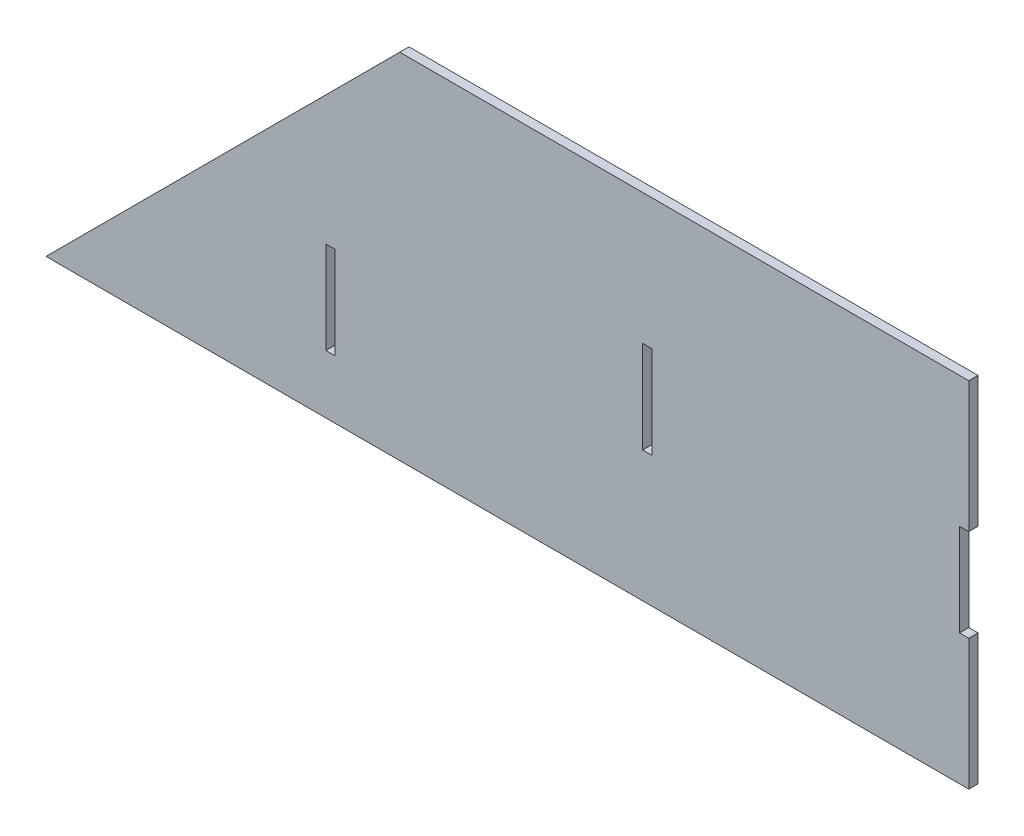
ISO-10303-21;
HEADER;
FILE_DESCRIPTION(('STEP AP214'),'2;1');
FILE_NAME('part.step','',(''),(''),'','','');
FILE_SCHEMA(('AUTOMOTIVE_DESIGN { 1 0 10303 214 1 1 1 1 }'));
ENDSEC;
DATA;
#1=APPLICATION_CONTEXT('core data for automotive mechanical design processes');
#2=APPLICATION_PROTOCOL_DEFINITION('international standard','automotive_design',2000,#1);
#3=PRODUCT_CONTEXT('',#1,'mechanical');
#4=PRODUCT('Part','Part','',(#3));
#5=PRODUCT_RELATED_PRODUCT_CATEGORY('part','',(#4));
#6=PRODUCT_DEFINITION_FORMATION('','',#4);
#7=PRODUCT_DEFINITION_CONTEXT('part definition',#1,'design');
#8=PRODUCT_DEFINITION('design','',#6,#7);
#9=PRODUCT_DEFINITION_SHAPE('','',#8);
#10=(LENGTH_UNIT() NAMED_UNIT(*) SI_UNIT(.MILLI.,.METRE.));
#11=(NAMED_UNIT(*) PLANE_ANGLE_UNIT() SI_UNIT($,.RADIAN.));
#12=(NAMED_UNIT(*) SI_UNIT($,.STERADIAN.) SOLID_ANGLE_UNIT());
#13=UNCERTAINTY_MEASURE_WITH_UNIT(LENGTH_MEASURE(1.E-05),#10,'distance_accuracy_value','');
#14=(GEOMETRIC_REPRESENTATION_CONTEXT(3) GLOBAL_UNCERTAINTY_ASSIGNED_CONTEXT((#13)) GLOBAL_UNIT_ASSIGNED_CONTEXT((#10,
#11,#12)) REPRESENTATION_CONTEXT('',''));
#15=CARTESIAN_POINT('',(0.,0.,0.));
#16=DIRECTION('',(0.,0.,1.));
#17=DIRECTION('',(1.,0.,0.));
#18=AXIS2_PLACEMENT_3D('',#15,#16,#17);
#19=CARTESIAN_POINT('',(0.,18.9920835924817,3.));
#20=DIRECTION('',(0.,-1.,0.));
#21=DIRECTION('',(0.,0.,-1.));
#22=AXIS2_PLACEMENT_3D('',#19,#20,#21);
#23=PLANE('',#22);
#24=DIRECTION('',(-1.,0.,0.));
#25=VECTOR('',#24,1.);
#26=CARTESIAN_POINT('',(0.,18.9920835924817,0.));
#27=LINE('',#26,#25);
#28=CARTESIAN_POINT('',(94.,18.9920835924817,0.));
#29=VERTEX_POINT('',#28);
#30=CARTESIAN_POINT('',(91.,18.9920835924817,0.));
#31=VERTEX_POINT('',#30);
#32=EDGE_CURVE('E219',#29,#31,#27,.T.);
#33=ORIENTED_EDGE('',*,*,#32,.T.);
#34=DIRECTION('',(0.,0.,-1.));
#35=VECTOR('',#34,1.);
#36=CARTESIAN_POINT('',(91.,18.9920835924817,3.));
#37=LINE('',#36,#35);
#38=CARTESIAN_POINT('',(91.,18.9920835924817,3.));
#39=VERTEX_POINT('',#38);
#40=EDGE_CURVE('E11',#39,#31,#37,.T.);
#41=ORIENTED_EDGE('',*,*,#40,.F.);
#42=DIRECTION('',(-1.,0.,0.));
#43=VECTOR('',#42,1.);
#44=CARTESIAN_POINT('',(0.,18.9920835924817,3.));
#45=LINE('',#44,#43);
#46=CARTESIAN_POINT('',(94.,18.9920835924817,3.));
#47=VERTEX_POINT('',#46);
#48=EDGE_CURVE('E166',#47,#39,#45,.T.);
#49=ORIENTED_EDGE('',*,*,#48,.F.);
#50=DIRECTION('',(0.,0.,-1.));
#51=VECTOR('',#50,1.);
#52=CARTESIAN_POINT('',(94.,18.9920835924817,3.));
#53=LINE('',#52,#51);
#54=EDGE_CURVE('E58',#47,#29,#53,.T.);
#55=ORIENTED_EDGE('',*,*,#54,.T.);
#56=EDGE_LOOP('',(#33,#41,#49,#55));
#57=FACE_BOUND('',#56,.T.);
#58=ADVANCED_FACE('F39',(#57),#23,.F.);
#59=CARTESIAN_POINT('',(91.,0.,3.));
#60=DIRECTION('',(-1.,0.,0.));
#61=DIRECTION('',(0.,0.,1.));
#62=AXIS2_PLACEMENT_3D('',#59,#60,#61);
#63=PLANE('',#62);
#64=DIRECTION('',(0.,1.,0.));
#65=VECTOR('',#64,1.);
#66=CARTESIAN_POINT('',(91.,0.,0.));
#67=LINE('',#66,#65);
#68=CARTESIAN_POINT('',(91.,48.9920835924817,0.));
#69=VERTEX_POINT('',#68);
#70=EDGE_CURVE('E172',#31,#69,#67,.T.);
#71=ORIENTED_EDGE('',*,*,#70,.T.);
#72=DIRECTION('',(0.,0.,-1.));
#73=VECTOR('',#72,1.);
#74=CARTESIAN_POINT('',(91.,48.9920835924817,3.));
#75=LINE('',#74,#73);
#76=CARTESIAN_POINT('',(91.,48.9920835924817,3.));
#77=VERTEX_POINT('',#76);
#78=EDGE_CURVE('E49',#77,#69,#75,.T.);
#79=ORIENTED_EDGE('',*,*,#78,.F.);
#80=DIRECTION('',(0.,1.,0.));
#81=VECTOR('',#80,1.);
#82=CARTESIAN_POINT('',(91.,0.,3.));
#83=LINE('',#82,#81);
#84=EDGE_CURVE('E160',#39,#77,#83,.T.);
#85=ORIENTED_EDGE('',*,*,#84,.F.);
#86=ORIENTED_EDGE('',*,*,#40,.T.);
#87=EDGE_LOOP('',(#71,#79,#85,#86));
#88=FACE_BOUND('',#87,.T.);
#89=ADVANCED_FACE('F171',(#88),#63,.F.);
#90=CARTESIAN_POINT('',(1.13316956726529E-13,48.9920835924819,3.));
#91=DIRECTION('',(0.,-1.,0.));
#92=DIRECTION('',(1.,0.,0.));
#93=AXIS2_PLACEMENT_3D('',#90,#91,#92);
#94=PLANE('',#93);
#95=DIRECTION('',(-1.,0.,0.));
#96=VECTOR('',#95,1.);
#97=CARTESIAN_POINT('',(1.13316956726529E-13,48.9920835924819,0.));
#98=LINE('',#97,#96);
#99=CARTESIAN_POINT('',(94.,48.9920835924817,0.));
#100=VERTEX_POINT('',#99);
#101=EDGE_CURVE('E222',#100,#69,#98,.T.);
#102=ORIENTED_EDGE('',*,*,#101,.F.);
#103=DIRECTION('',(0.,0.,-1.));
#104=VECTOR('',#103,1.);
#105=CARTESIAN_POINT('',(94.,48.9920835924817,3.));
#106=LINE('',#105,#104);
#107=CARTESIAN_POINT('',(94.,48.9920835924817,3.));
#108=VERTEX_POINT('',#107);
#109=EDGE_CURVE('E108',#108,#100,#106,.T.);
#110=ORIENTED_EDGE('',*,*,#109,.F.);
#111=DIRECTION('',(-1.,0.,0.));
#112=VECTOR('',#111,1.);
#113=CARTESIAN_POINT('',(1.13316956726529E-13,48.9920835924819,3.));
#114=LINE('',#113,#112);
#115=EDGE_CURVE('E165',#108,#77,#114,.T.);
#116=ORIENTED_EDGE('',*,*,#115,.T.);
#117=ORIENTED_EDGE('',*,*,#78,.T.);
#118=EDGE_LOOP('',(#102,#110,#116,#117));
#119=FACE_BOUND('',#118,.T.);
#120=ADVANCED_FACE('F176',(#119),#94,.T.);
#121=CARTESIAN_POINT('',(0.,42.5,3.));
#122=DIRECTION('',(0.,-1.,0.));
#123=DIRECTION('',(0.,0.,-1.));
#124=AXIS2_PLACEMENT_3D('',#121,#122,#123);
#125=PLANE('',#124);
#126=DIRECTION('',(-1.,0.,0.));
#127=VECTOR('',#126,1.);
#128=CARTESIAN_POINT('',(0.,42.5,0.));
#129=LINE('',#128,#127);
#130=CARTESIAN_POINT('',(197.,42.5,0.));
#131=VERTEX_POINT('',#130);
#132=CARTESIAN_POINT('',(194.,42.5,0.));
#133=VERTEX_POINT('',#132);
#134=EDGE_CURVE('E207',#131,#133,#129,.T.);
#135=ORIENTED_EDGE('',*,*,#134,.T.);
#136=DIRECTION('',(0.,0.,-1.));
#137=VECTOR('',#136,1.);
#138=CARTESIAN_POINT('',(194.,42.5,3.));
#139=LINE('',#138,#137);
#140=CARTESIAN_POINT('',(194.,42.5,3.));
#141=VERTEX_POINT('',#140);
#142=EDGE_CURVE('E229',#141,#133,#139,.T.);
#143=ORIENTED_EDGE('',*,*,#142,.F.);
#144=DIRECTION('',(-1.,0.,0.));
#145=VECTOR('',#144,1.);
#146=CARTESIAN_POINT('',(0.,42.5,3.));
#147=LINE('',#146,#145);
#148=CARTESIAN_POINT('',(197.,42.5,3.));
#149=VERTEX_POINT('',#148);
#150=EDGE_CURVE('E291',#149,#141,#147,.T.);
#151=ORIENTED_EDGE('',*,*,#150,.F.);
#152=DIRECTION('',(0.,0.,-1.));
#153=VECTOR('',#152,1.);
#154=CARTESIAN_POINT('',(197.,42.5,3.));
#155=LINE('',#154,#153);
#156=EDGE_CURVE('E231',#149,#131,#155,.T.);
#157=ORIENTED_EDGE('',*,*,#156,.T.);
#158=EDGE_LOOP('',(#135,#143,#151,#157));
#159=FACE_BOUND('',#158,.T.);
#160=ADVANCED_FACE('F315',(#159),#125,.F.);
#161=CARTESIAN_POINT('',(194.,0.,3.));
#162=DIRECTION('',(-1.,0.,0.));
#163=DIRECTION('',(0.,0.,1.));
#164=AXIS2_PLACEMENT_3D('',#161,#162,#163);
#165=PLANE('',#164);
#166=DIRECTION('',(0.,1.,0.));
#167=VECTOR('',#166,1.);
#168=CARTESIAN_POINT('',(194.,0.,0.));
#169=LINE('',#168,#167);
#170=CARTESIAN_POINT('',(194.,72.5000000000001,0.));
#171=VERTEX_POINT('',#170);
#172=EDGE_CURVE('E210',#133,#171,#169,.T.);
#173=ORIENTED_EDGE('',*,*,#172,.T.);
#174=DIRECTION('',(0.,0.,-1.));
#175=VECTOR('',#174,1.);
#176=CARTESIAN_POINT('',(194.,72.5000000000001,3.));
#177=LINE('',#176,#175);
#178=CARTESIAN_POINT('',(194.,72.5000000000001,3.));
#179=VERTEX_POINT('',#178);
#180=EDGE_CURVE('E235',#179,#171,#177,.T.);
#181=ORIENTED_EDGE('',*,*,#180,.F.);
#182=DIRECTION('',(0.,1.,0.));
#183=VECTOR('',#182,1.);
#184=CARTESIAN_POINT('',(194.,0.,3.));
#185=LINE('',#184,#183);
#186=EDGE_CURVE('E294',#141,#179,#185,.T.);
#187=ORIENTED_EDGE('',*,*,#186,.F.);
#188=ORIENTED_EDGE('',*,*,#142,.T.);
#189=EDGE_LOOP('',(#173,#181,#187,#188));
#190=FACE_BOUND('',#189,.T.);
#191=ADVANCED_FACE('F317',(#190),#165,.F.);
#192=CARTESIAN_POINT('',(0.,72.5000000000001,3.));
#193=DIRECTION('',(0.,-1.,0.));
#194=DIRECTION('',(0.,0.,-1.));
#195=AXIS2_PLACEMENT_3D('',#192,#193,#194);
#196=PLANE('',#195);
#197=DIRECTION('',(-1.,0.,0.));
#198=VECTOR('',#197,1.);
#199=CARTESIAN_POINT('',(0.,72.5000000000001,0.));
#200=LINE('',#199,#198);
#201=CARTESIAN_POINT('',(197.,72.5000000000001,0.));
#202=VERTEX_POINT('',#201);
#203=EDGE_CURVE('E213',#202,#171,#200,.T.);
#204=ORIENTED_EDGE('',*,*,#203,.F.);
#205=DIRECTION('',(0.,0.,-1.));
#206=VECTOR('',#205,1.);
#207=CARTESIAN_POINT('',(197.,72.5000000000001,3.));
#208=LINE('',#207,#206);
#209=CARTESIAN_POINT('',(197.,72.5000000000001,3.));
#210=VERTEX_POINT('',#209);
#211=EDGE_CURVE('E233',#210,#202,#208,.T.);
#212=ORIENTED_EDGE('',*,*,#211,.F.);
#213=DIRECTION('',(-1.,0.,0.));
#214=VECTOR('',#213,1.);
#215=CARTESIAN_POINT('',(0.,72.5000000000001,3.));
#216=LINE('',#215,#214);
#217=EDGE_CURVE('E296',#210,#179,#216,.T.);
#218=ORIENTED_EDGE('',*,*,#217,.T.);
#219=ORIENTED_EDGE('',*,*,#180,.T.);
#220=EDGE_LOOP('',(#204,#212,#218,#219));
#221=FACE_BOUND('',#220,.T.);
#222=ADVANCED_FACE('F311',(#221),#196,.T.);
#223=CARTESIAN_POINT('',(300.,0.,3.));
#224=DIRECTION('',(1.,0.,0.));
#225=DIRECTION('',(0.,0.,-1.));
#226=AXIS2_PLACEMENT_3D('',#223,#224,#225);
#227=PLANE('',#226);
#228=DIRECTION('',(0.,-1.,0.));
#229=VECTOR('',#228,1.);
#230=CARTESIAN_POINT('',(300.,0.,0.));
#231=LINE('',#230,#229);
#232=CARTESIAN_POINT('',(300.,42.4999999999995,0.));
#233=VERTEX_POINT('',#232);
#234=CARTESIAN_POINT('',(300.,0.,0.));
#235=VERTEX_POINT('',#234);
#236=EDGE_CURVE('E183',#233,#235,#231,.T.);
#237=ORIENTED_EDGE('',*,*,#236,.F.);
#238=DIRECTION('',(0.,0.,-1.));
#239=VECTOR('',#238,1.);
#240=CARTESIAN_POINT('',(300.,42.4999999999995,3.));
#241=LINE('',#240,#239);
#242=CARTESIAN_POINT('',(300.,42.4999999999995,3.));
#243=VERTEX_POINT('',#242);
#244=EDGE_CURVE('E43',#243,#233,#241,.T.);
#245=ORIENTED_EDGE('',*,*,#244,.F.);
#246=DIRECTION('',(0.,-1.,0.));
#247=VECTOR('',#246,1.);
#248=CARTESIAN_POINT('',(300.,0.,3.));
#249=LINE('',#248,#247);
#250=CARTESIAN_POINT('',(300.,0.,3.));
#251=VERTEX_POINT('',#250);
#252=EDGE_CURVE('E227',#243,#251,#249,.T.);
#253=ORIENTED_EDGE('',*,*,#252,.T.);
#254=DIRECTION('',(0.,0.,-1.));
#255=VECTOR('',#254,1.);
#256=CARTESIAN_POINT('',(300.,0.,3.));
#257=LINE('',#256,#255);
#258=EDGE_CURVE('E179',#251,#235,#257,.T.);
#259=ORIENTED_EDGE('',*,*,#258,.T.);
#260=EDGE_LOOP('',(#237,#245,#253,#259));
#261=FACE_BOUND('',#260,.T.);
#262=ADVANCED_FACE('F41',(#261),#227,.T.);
#263=CARTESIAN_POINT('',(6.48786580016017E-12,42.5000000000453,3.));
#264=DIRECTION('',(1.52655665885959E-13,1.,0.));
#265=DIRECTION('',(-1.,1.52655665885959E-13,0.));
#266=AXIS2_PLACEMENT_3D('',#263,#264,#265);
#267=PLANE('',#266);
#268=DIRECTION('',(1.,-1.52655665885959E-13,0.));
#269=VECTOR('',#268,1.);
#270=CARTESIAN_POINT('',(6.48786580016017E-12,42.5000000000453,0.));
#271=LINE('',#270,#269);
#272=CARTESIAN_POINT('',(297.,42.5,0.));
#273=VERTEX_POINT('',#272);
#274=EDGE_CURVE('E186',#273,#233,#271,.T.);
#275=ORIENTED_EDGE('',*,*,#274,.F.);
#276=DIRECTION('',(0.,0.,-1.));
#277=VECTOR('',#276,1.);
#278=CARTESIAN_POINT('',(297.,42.5,3.));
#279=LINE('',#278,#277);
#280=CARTESIAN_POINT('',(297.,42.5,3.));
#281=VERTEX_POINT('',#280);
#282=EDGE_CURVE('E249',#281,#273,#279,.T.);
#283=ORIENTED_EDGE('',*,*,#282,.F.);
#284=DIRECTION('',(1.,-1.52655665885959E-13,0.));
#285=VECTOR('',#284,1.);
#286=CARTESIAN_POINT('',(6.48786580016017E-12,42.5000000000453,3.));
#287=LINE('',#286,#285);
#288=EDGE_CURVE('E258',#281,#243,#287,.T.);
#289=ORIENTED_EDGE('',*,*,#288,.T.);
#290=ORIENTED_EDGE('',*,*,#244,.T.);
#291=EDGE_LOOP('',(#275,#283,#289,#290));
#292=FACE_BOUND('',#291,.T.);
#293=ADVANCED_FACE('F256',(#292),#267,.T.);
#294=CARTESIAN_POINT('',(297.,0.,3.));
#295=DIRECTION('',(1.,0.,0.));
#296=DIRECTION('',(0.,0.,-1.));
#297=AXIS2_PLACEMENT_3D('',#294,#295,#296);
#298=PLANE('',#297);
#299=DIRECTION('',(0.,-1.,0.));
#300=VECTOR('',#299,1.);
#301=CARTESIAN_POINT('',(297.,0.,0.));
#302=LINE('',#301,#300);
#303=CARTESIAN_POINT('',(297.,72.5,0.));
#304=VERTEX_POINT('',#303);
#305=EDGE_CURVE('E189',#304,#273,#302,.T.);
#306=ORIENTED_EDGE('',*,*,#305,.F.);
#307=DIRECTION('',(0.,0.,-1.));
#308=VECTOR('',#307,1.);
#309=CARTESIAN_POINT('',(297.,72.5,3.));
#310=LINE('',#309,#308);
#311=CARTESIAN_POINT('',(297.,72.5,3.));
#312=VERTEX_POINT('',#311);
#313=EDGE_CURVE('E248',#312,#304,#310,.T.);
#314=ORIENTED_EDGE('',*,*,#313,.F.);
#315=DIRECTION('',(0.,-1.,0.));
#316=VECTOR('',#315,1.);
#317=CARTESIAN_POINT('',(297.,0.,3.));
#318=LINE('',#317,#316);
#319=EDGE_CURVE('E266',#312,#281,#318,.T.);
#320=ORIENTED_EDGE('',*,*,#319,.T.);
#321=ORIENTED_EDGE('',*,*,#282,.T.);
#322=EDGE_LOOP('',(#306,#314,#320,#321));
#323=FACE_BOUND('',#322,.T.);
#324=ADVANCED_FACE('F264',(#323),#298,.T.);
#325=CARTESIAN_POINT('',(0.,72.5,3.));
#326=DIRECTION('',(0.,-1.,0.));
#327=DIRECTION('',(0.,0.,-1.));
#328=AXIS2_PLACEMENT_3D('',#325,#326,#327);
#329=PLANE('',#328);
#330=DIRECTION('',(-1.,0.,0.));
#331=VECTOR('',#330,1.);
#332=CARTESIAN_POINT('',(0.,72.5,0.));
#333=LINE('',#332,#331);
#334=CARTESIAN_POINT('',(300.,72.5,0.));
#335=VERTEX_POINT('',#334);
#336=EDGE_CURVE('E192',#335,#304,#333,.T.);
#337=ORIENTED_EDGE('',*,*,#336,.F.);
#338=DIRECTION('',(0.,0.,-1.));
#339=VECTOR('',#338,1.);
#340=CARTESIAN_POINT('',(300.,72.5,3.));
#341=LINE('',#340,#339);
#342=CARTESIAN_POINT('',(300.,72.5,3.));
#343=VERTEX_POINT('',#342);
#344=EDGE_CURVE('E246',#343,#335,#341,.T.);
#345=ORIENTED_EDGE('',*,*,#344,.F.);
#346=DIRECTION('',(-1.,0.,0.));
#347=VECTOR('',#346,1.);
#348=CARTESIAN_POINT('',(0.,72.5,3.));
#349=LINE('',#348,#347);
#350=EDGE_CURVE('E273',#343,#312,#349,.T.);
#351=ORIENTED_EDGE('',*,*,#350,.T.);
#352=ORIENTED_EDGE('',*,*,#313,.T.);
#353=EDGE_LOOP('',(#337,#345,#351,#352));
#354=FACE_BOUND('',#353,.T.);
#355=ADVANCED_FACE('F276',(#354),#329,.T.);
#356=CARTESIAN_POINT('',(300.,0.,3.));
#357=DIRECTION('',(1.,0.,0.));
#358=DIRECTION('',(0.,0.,-1.));
#359=AXIS2_PLACEMENT_3D('',#356,#357,#358);
#360=PLANE('',#359);
#361=DIRECTION('',(0.,-1.,0.));
#362=VECTOR('',#361,1.);
#363=CARTESIAN_POINT('',(300.,0.,0.));
#364=LINE('',#363,#362);
#365=CARTESIAN_POINT('',(300.,115.,0.));
#366=VERTEX_POINT('',#365);
#367=EDGE_CURVE('E195',#366,#335,#364,.T.);
#368=ORIENTED_EDGE('',*,*,#367,.F.);
#369=DIRECTION('',(0.,0.,-1.));
#370=VECTOR('',#369,1.);
#371=CARTESIAN_POINT('',(300.,115.,3.));
#372=LINE('',#371,#370);
#373=CARTESIAN_POINT('',(300.,115.,3.));
#374=VERTEX_POINT('',#373);
#375=EDGE_CURVE('E244',#374,#366,#372,.T.);
#376=ORIENTED_EDGE('',*,*,#375,.F.);
#377=DIRECTION('',(0.,-1.,0.));
#378=VECTOR('',#377,1.);
#379=CARTESIAN_POINT('',(300.,0.,3.));
#380=LINE('',#379,#378);
#381=EDGE_CURVE('E277',#374,#343,#380,.T.);
#382=ORIENTED_EDGE('',*,*,#381,.T.);
#383=ORIENTED_EDGE('',*,*,#344,.T.);
#384=EDGE_LOOP('',(#368,#376,#382,#383));
#385=FACE_BOUND('',#384,.T.);
#386=ADVANCED_FACE('F350',(#385),#360,.T.);
#387=CARTESIAN_POINT('',(0.,115.,3.));
#388=DIRECTION('',(0.,1.,0.));
#389=DIRECTION('',(-1.,0.,0.));
#390=AXIS2_PLACEMENT_3D('',#387,#388,#389);
#391=PLANE('',#390);
#392=DIRECTION('',(1.,0.,0.));
#393=VECTOR('',#392,1.);
#394=CARTESIAN_POINT('',(0.,115.,0.));
#395=LINE('',#394,#393);
#396=CARTESIAN_POINT('',(115.000000000001,115.,0.));
#397=VERTEX_POINT('',#396);
#398=EDGE_CURVE('E198',#397,#366,#395,.T.);
#399=ORIENTED_EDGE('',*,*,#398,.F.);
#400=DIRECTION('',(0.,0.,-1.));
#401=VECTOR('',#400,1.);
#402=CARTESIAN_POINT('',(115.000000000001,115.,3.));
#403=LINE('',#402,#401);
#404=CARTESIAN_POINT('',(115.000000000001,115.,3.));
#405=VERTEX_POINT('',#404);
#406=EDGE_CURVE('E242',#405,#397,#403,.T.);
#407=ORIENTED_EDGE('',*,*,#406,.F.);
#408=DIRECTION('',(1.,0.,0.));
#409=VECTOR('',#408,1.);
#410=CARTESIAN_POINT('',(0.,115.,3.));
#411=LINE('',#410,#409);
#412=EDGE_CURVE('E279',#405,#374,#411,.T.);
#413=ORIENTED_EDGE('',*,*,#412,.T.);
#414=ORIENTED_EDGE('',*,*,#375,.T.);
#415=EDGE_LOOP('',(#399,#407,#413,#414));
#416=FACE_BOUND('',#415,.T.);
#417=ADVANCED_FACE('F344',(#416),#391,.T.);
#418=CARTESIAN_POINT('',(0.,0.,3.));
#419=DIRECTION('',(-0.707106781186544,0.707106781186551,0.));
#420=DIRECTION('',(-0.707106781186551,-0.707106781186544,0.));
#421=AXIS2_PLACEMENT_3D('',#418,#419,#420);
#422=PLANE('',#421);
#423=DIRECTION('',(0.707106781186551,0.707106781186544,0.));
#424=VECTOR('',#423,1.);
#425=CARTESIAN_POINT('',(0.,0.,0.));
#426=LINE('',#425,#424);
#427=CARTESIAN_POINT('',(0.,0.,0.));
#428=VERTEX_POINT('',#427);
#429=EDGE_CURVE('E201',#428,#397,#426,.T.);
#430=ORIENTED_EDGE('',*,*,#429,.F.);
#431=DIRECTION('',(0.,0.,-1.));
#432=VECTOR('',#431,1.);
#433=CARTESIAN_POINT('',(0.,0.,3.));
#434=LINE('',#433,#432);
#435=CARTESIAN_POINT('',(0.,0.,3.));
#436=VERTEX_POINT('',#435);
#437=EDGE_CURVE('E240',#436,#428,#434,.T.);
#438=ORIENTED_EDGE('',*,*,#437,.F.);
#439=DIRECTION('',(0.707106781186551,0.707106781186544,0.));
#440=VECTOR('',#439,1.);
#441=CARTESIAN_POINT('',(0.,0.,3.));
#442=LINE('',#441,#440);
#443=EDGE_CURVE('E285',#436,#405,#442,.T.);
#444=ORIENTED_EDGE('',*,*,#443,.T.);
#445=ORIENTED_EDGE('',*,*,#406,.T.);
#446=EDGE_LOOP('',(#430,#438,#444,#445));
#447=FACE_BOUND('',#446,.T.);
#448=ADVANCED_FACE('F336',(#447),#422,.T.);
#449=CARTESIAN_POINT('',(197.,0.,3.));
#450=DIRECTION('',(-1.,0.,0.));
#451=DIRECTION('',(0.,0.,1.));
#452=AXIS2_PLACEMENT_3D('',#449,#450,#451);
#453=PLANE('',#452);
#454=DIRECTION('',(0.,1.,0.));
#455=VECTOR('',#454,1.);
#456=CARTESIAN_POINT('',(197.,0.,0.));
#457=LINE('',#456,#455);
#458=EDGE_CURVE('E216',#131,#202,#457,.T.);
#459=ORIENTED_EDGE('',*,*,#458,.F.);
#460=ORIENTED_EDGE('',*,*,#156,.F.);
#461=DIRECTION('',(0.,1.,0.));
#462=VECTOR('',#461,1.);
#463=CARTESIAN_POINT('',(197.,0.,3.));
#464=LINE('',#463,#462);
#465=EDGE_CURVE('E299',#149,#210,#464,.T.);
#466=ORIENTED_EDGE('',*,*,#465,.T.);
#467=ORIENTED_EDGE('',*,*,#211,.T.);
#468=EDGE_LOOP('',(#459,#460,#466,#467));
#469=FACE_BOUND('',#468,.T.);
#470=ADVANCED_FACE('F304',(#469),#453,.T.);
#471=CARTESIAN_POINT('',(0.,0.,3.));
#472=DIRECTION('',(0.,-1.,0.));
#473=DIRECTION('',(1.,0.,0.));
#474=AXIS2_PLACEMENT_3D('',#471,#472,#473);
#475=PLANE('',#474);
#476=DIRECTION('',(-1.,0.,0.));
#477=VECTOR('',#476,1.);
#478=CARTESIAN_POINT('',(0.,0.,0.));
#479=LINE('',#478,#477);
#480=EDGE_CURVE('E204',#235,#428,#479,.T.);
#481=ORIENTED_EDGE('',*,*,#480,.F.);
#482=ORIENTED_EDGE('',*,*,#258,.F.);
#483=DIRECTION('',(-1.,0.,0.));
#484=VECTOR('',#483,1.);
#485=CARTESIAN_POINT('',(0.,0.,3.));
#486=LINE('',#485,#484);
#487=EDGE_CURVE('E288',#251,#436,#486,.T.);
#488=ORIENTED_EDGE('',*,*,#487,.T.);
#489=ORIENTED_EDGE('',*,*,#437,.T.);
#490=EDGE_LOOP('',(#481,#482,#488,#489));
#491=FACE_BOUND('',#490,.T.);
#492=ADVANCED_FACE('F335',(#491),#475,.T.);
#493=CARTESIAN_POINT('',(94.,0.,3.));
#494=DIRECTION('',(-1.,0.,0.));
#495=DIRECTION('',(0.,0.,1.));
#496=AXIS2_PLACEMENT_3D('',#493,#494,#495);
#497=PLANE('',#496);
#498=DIRECTION('',(0.,1.,0.));
#499=VECTOR('',#498,1.);
#500=CARTESIAN_POINT('',(94.,0.,0.));
#501=LINE('',#500,#499);
#502=EDGE_CURVE('E224',#29,#100,#501,.T.);
#503=ORIENTED_EDGE('',*,*,#502,.F.);
#504=ORIENTED_EDGE('',*,*,#54,.F.);
#505=DIRECTION('',(0.,1.,0.));
#506=VECTOR('',#505,1.);
#507=CARTESIAN_POINT('',(94.,0.,3.));
#508=LINE('',#507,#506);
#509=EDGE_CURVE('E177',#47,#108,#508,.T.);
#510=ORIENTED_EDGE('',*,*,#509,.T.);
#511=ORIENTED_EDGE('',*,*,#109,.T.);
#512=EDGE_LOOP('',(#503,#504,#510,#511));
#513=FACE_BOUND('',#512,.T.);
#514=ADVANCED_FACE('F341',(#513),#497,.T.);
#515=CARTESIAN_POINT('',(0.,0.,3.));
#516=DIRECTION('',(0.,0.,1.));
#517=DIRECTION('',(1.,0.,0.));
#518=AXIS2_PLACEMENT_3D('',#515,#516,#517);
#519=PLANE('',#518);
#520=ORIENTED_EDGE('',*,*,#252,.F.);
#521=ORIENTED_EDGE('',*,*,#288,.F.);
#522=ORIENTED_EDGE('',*,*,#319,.F.);
#523=ORIENTED_EDGE('',*,*,#350,.F.);
#524=ORIENTED_EDGE('',*,*,#381,.F.);
#525=ORIENTED_EDGE('',*,*,#412,.F.);
#526=ORIENTED_EDGE('',*,*,#443,.F.);
#527=ORIENTED_EDGE('',*,*,#487,.F.);
#528=EDGE_LOOP('',(#520,#521,#522,#523,#524,#525,#526,#527));
#529=FACE_BOUND('',#528,.T.);
#530=ORIENTED_EDGE('',*,*,#150,.T.);
#531=ORIENTED_EDGE('',*,*,#186,.T.);
#532=ORIENTED_EDGE('',*,*,#217,.F.);
#533=ORIENTED_EDGE('',*,*,#465,.F.);
#534=EDGE_LOOP('',(#530,#531,#532,#533));
#535=FACE_BOUND('',#534,.T.);
#536=ORIENTED_EDGE('',*,*,#48,.T.);
#537=ORIENTED_EDGE('',*,*,#84,.T.);
#538=ORIENTED_EDGE('',*,*,#115,.F.);
#539=ORIENTED_EDGE('',*,*,#509,.F.);
#540=EDGE_LOOP('',(#536,#537,#538,#539));
#541=FACE_BOUND('',#540,.T.);
#542=ADVANCED_FACE('F162',(#529,#535,#541),#519,.T.);
#543=CARTESIAN_POINT('',(0.,0.,0.));
#544=DIRECTION('',(0.,0.,1.));
#545=DIRECTION('',(1.,0.,0.));
#546=AXIS2_PLACEMENT_3D('',#543,#544,#545);
#547=PLANE('',#546);
#548=ORIENTED_EDGE('',*,*,#236,.T.);
#549=ORIENTED_EDGE('',*,*,#480,.T.);
#550=ORIENTED_EDGE('',*,*,#429,.T.);
#551=ORIENTED_EDGE('',*,*,#398,.T.);
#552=ORIENTED_EDGE('',*,*,#367,.T.);
#553=ORIENTED_EDGE('',*,*,#336,.T.);
#554=ORIENTED_EDGE('',*,*,#305,.T.);
#555=ORIENTED_EDGE('',*,*,#274,.T.);
#556=EDGE_LOOP('',(#548,#549,#550,#551,#552,#553,#554,#555));
#557=FACE_BOUND('',#556,.T.);
#558=ORIENTED_EDGE('',*,*,#134,.F.);
#559=ORIENTED_EDGE('',*,*,#458,.T.);
#560=ORIENTED_EDGE('',*,*,#203,.T.);
#561=ORIENTED_EDGE('',*,*,#172,.F.);
#562=EDGE_LOOP('',(#558,#559,#560,#561));
#563=FACE_BOUND('',#562,.T.);
#564=ORIENTED_EDGE('',*,*,#32,.F.);
#565=ORIENTED_EDGE('',*,*,#502,.T.);
#566=ORIENTED_EDGE('',*,*,#101,.T.);
#567=ORIENTED_EDGE('',*,*,#70,.F.);
#568=EDGE_LOOP('',(#564,#565,#566,#567));
#569=FACE_BOUND('',#568,.T.);
#570=ADVANCED_FACE('F261',(#557,#563,#569),#547,.F.);
#571=CLOSED_SHELL('',(#58,#89,#120,#160,#191,#222,#262,#293,#324,#355,#386,#417,#448,#470,#492,
#514,#542,#570));
#572=MANIFOLD_SOLID_BREP('B2',#571);
#573=ADVANCED_BREP_SHAPE_REPRESENTATION('',(#18,#572),#14);
#574=SHAPE_DEFINITION_REPRESENTATION(#9,#573);
ENDSEC;
END-ISO-10303-21;
